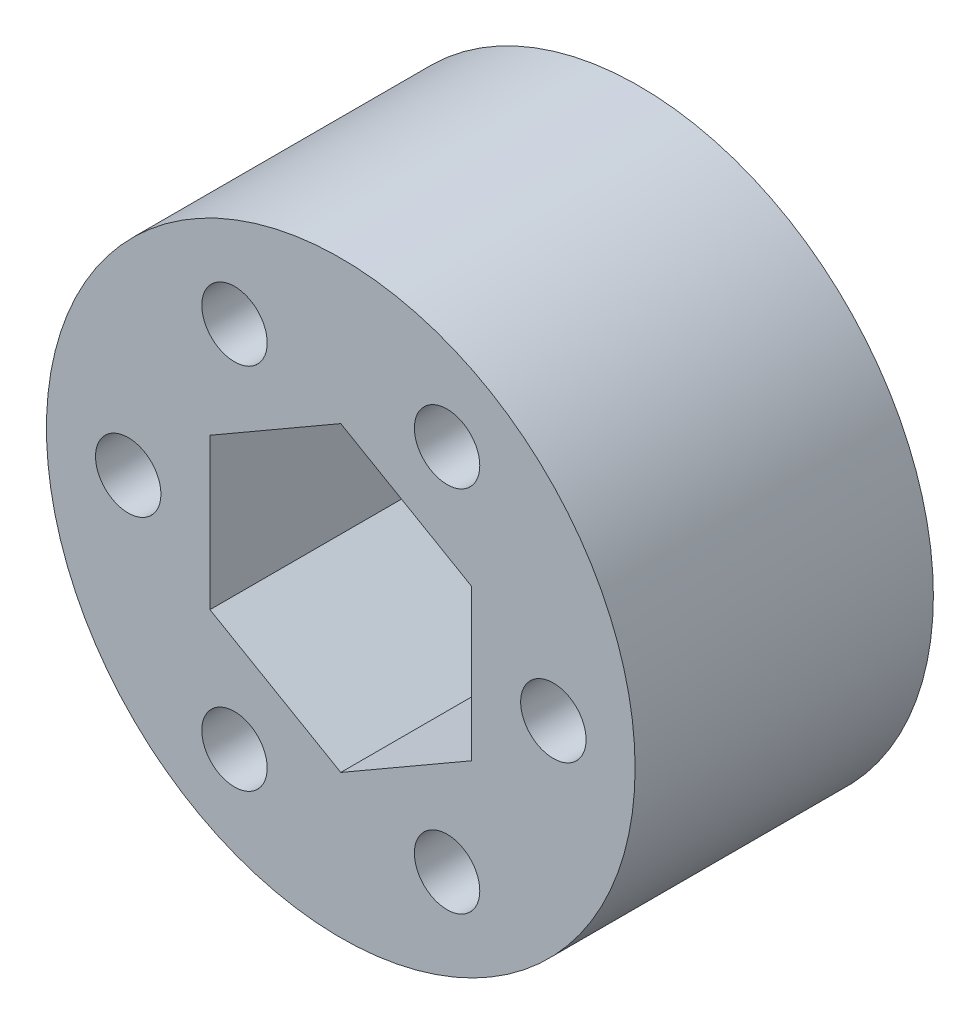
ISO-10303-21;
HEADER;
FILE_DESCRIPTION(('STEP AP214'),'2;1');
FILE_NAME('part.step','',(''),(''),'','','');
FILE_SCHEMA(('AUTOMOTIVE_DESIGN { 1 0 10303 214 1 1 1 1 }'));
ENDSEC;
DATA;
#1=APPLICATION_CONTEXT('core data for automotive mechanical design processes');
#2=APPLICATION_PROTOCOL_DEFINITION('international standard','automotive_design',2000,#1);
#3=PRODUCT_CONTEXT('',#1,'mechanical');
#4=PRODUCT('Part','Part','',(#3));
#5=PRODUCT_RELATED_PRODUCT_CATEGORY('part','',(#4));
#6=PRODUCT_DEFINITION_FORMATION('','',#4);
#7=PRODUCT_DEFINITION_CONTEXT('part definition',#1,'design');
#8=PRODUCT_DEFINITION('design','',#6,#7);
#9=PRODUCT_DEFINITION_SHAPE('','',#8);
#10=(LENGTH_UNIT() NAMED_UNIT(*) SI_UNIT(.MILLI.,.METRE.));
#11=(NAMED_UNIT(*) PLANE_ANGLE_UNIT() SI_UNIT($,.RADIAN.));
#12=(NAMED_UNIT(*) SI_UNIT($,.STERADIAN.) SOLID_ANGLE_UNIT());
#13=UNCERTAINTY_MEASURE_WITH_UNIT(LENGTH_MEASURE(1.E-05),#10,'distance_accuracy_value','');
#14=(GEOMETRIC_REPRESENTATION_CONTEXT(3) GLOBAL_UNCERTAINTY_ASSIGNED_CONTEXT((#13)) GLOBAL_UNIT_ASSIGNED_CONTEXT((#10,
#11,#12)) REPRESENTATION_CONTEXT('',''));
#15=CARTESIAN_POINT('',(0.,0.,0.));
#16=DIRECTION('',(0.,0.,1.));
#17=DIRECTION('',(1.,0.,0.));
#18=AXIS2_PLACEMENT_3D('',#15,#16,#17);
#19=CARTESIAN_POINT('',(0.,0.,7.239));
#20=DIRECTION('',(0.,0.,-1.));
#21=DIRECTION('',(-1.,0.,0.));
#22=AXIS2_PLACEMENT_3D('',#19,#20,#21);
#23=CYLINDRICAL_SURFACE('',#22,14.2875);
#24=CARTESIAN_POINT('',(0.,0.,7.239));
#25=DIRECTION('',(0.,0.,1.));
#26=DIRECTION('',(1.,0.,0.));
#27=AXIS2_PLACEMENT_3D('',#24,#25,#26);
#28=CIRCLE('',#27,14.2875);
#29=CARTESIAN_POINT('',(14.2875,0.,7.239));
#30=VERTEX_POINT('',#29);
#31=EDGE_CURVE('E11',#30,#30,#28,.T.);
#32=ORIENTED_EDGE('',*,*,#31,.F.);
#33=EDGE_LOOP('',(#32));
#34=FACE_BOUND('',#33,.T.);
#35=CARTESIAN_POINT('',(0.,0.,-7.239));
#36=DIRECTION('',(0.,0.,1.));
#37=DIRECTION('',(1.,0.,0.));
#38=AXIS2_PLACEMENT_3D('',#35,#36,#37);
#39=CIRCLE('',#38,14.2875);
#40=CARTESIAN_POINT('',(14.2875,0.,-7.239));
#41=VERTEX_POINT('',#40);
#42=EDGE_CURVE('E36',#41,#41,#39,.T.);
#43=ORIENTED_EDGE('',*,*,#42,.T.);
#44=EDGE_LOOP('',(#43));
#45=FACE_BOUND('',#44,.T.);
#46=ADVANCED_FACE('F33',(#34,#45),#23,.T.);
#47=CARTESIAN_POINT('',(0.,0.,7.239));
#48=DIRECTION('',(0.,0.,1.));
#49=DIRECTION('',(1.,0.,0.));
#50=AXIS2_PLACEMENT_3D('',#47,#48,#49);
#51=PLANE('',#50);
#52=CARTESIAN_POINT('',(-5.1593750000001,-8.93629963530062,7.239));
#53=DIRECTION('',(0.,0.,1.));
#54=DIRECTION('',(1.,0.,0.));
#55=AXIS2_PLACEMENT_3D('',#52,#53,#54);
#56=CIRCLE('',#55,1.5875);
#57=CARTESIAN_POINT('',(-3.5718750000001,-8.93629963530062,7.239));
#58=VERTEX_POINT('',#57);
#59=EDGE_CURVE('E110',#58,#58,#56,.T.);
#60=ORIENTED_EDGE('',*,*,#59,.F.);
#61=EDGE_LOOP('',(#60));
#62=FACE_BOUND('',#61,.T.);
#63=CARTESIAN_POINT('',(5.15937499999992,-8.93629963530072,7.239));
#64=DIRECTION('',(0.,0.,1.));
#65=DIRECTION('',(1.,0.,0.));
#66=AXIS2_PLACEMENT_3D('',#63,#64,#65);
#67=CIRCLE('',#66,1.5875);
#68=CARTESIAN_POINT('',(6.74687499999992,-8.93629963530072,7.239));
#69=VERTEX_POINT('',#68);
#70=EDGE_CURVE('E300',#69,#69,#67,.T.);
#71=ORIENTED_EDGE('',*,*,#70,.F.);
#72=EDGE_LOOP('',(#71));
#73=FACE_BOUND('',#72,.T.);
#74=CARTESIAN_POINT('',(10.31875,0.,7.239));
#75=DIRECTION('',(0.,0.,1.));
#76=DIRECTION('',(1.,0.,0.));
#77=AXIS2_PLACEMENT_3D('',#74,#75,#76);
#78=CIRCLE('',#77,1.5875);
#79=CARTESIAN_POINT('',(11.90625,0.,7.239));
#80=VERTEX_POINT('',#79);
#81=EDGE_CURVE('E307',#80,#80,#78,.T.);
#82=ORIENTED_EDGE('',*,*,#81,.F.);
#83=EDGE_LOOP('',(#82));
#84=FACE_BOUND('',#83,.T.);
#85=CARTESIAN_POINT('',(5.15937500000004,8.93629963530065,7.239));
#86=DIRECTION('',(0.,0.,1.));
#87=DIRECTION('',(1.,0.,0.));
#88=AXIS2_PLACEMENT_3D('',#85,#86,#87);
#89=CIRCLE('',#88,1.5875);
#90=CARTESIAN_POINT('',(6.74687500000004,8.93629963530065,7.239));
#91=VERTEX_POINT('',#90);
#92=EDGE_CURVE('E313',#91,#91,#89,.T.);
#93=ORIENTED_EDGE('',*,*,#92,.F.);
#94=EDGE_LOOP('',(#93));
#95=FACE_BOUND('',#94,.T.);
#96=CARTESIAN_POINT('',(-5.15937499999998,8.93629963530069,7.239));
#97=DIRECTION('',(0.,0.,1.));
#98=DIRECTION('',(1.,0.,0.));
#99=AXIS2_PLACEMENT_3D('',#96,#97,#98);
#100=CIRCLE('',#99,1.5875);
#101=CARTESIAN_POINT('',(-3.57187499999998,8.93629963530069,7.239));
#102=VERTEX_POINT('',#101);
#103=EDGE_CURVE('E319',#102,#102,#100,.T.);
#104=ORIENTED_EDGE('',*,*,#103,.F.);
#105=EDGE_LOOP('',(#104));
#106=FACE_BOUND('',#105,.T.);
#107=CARTESIAN_POINT('',(-10.31875,0.,7.239));
#108=DIRECTION('',(0.,0.,1.));
#109=DIRECTION('',(1.,0.,0.));
#110=AXIS2_PLACEMENT_3D('',#107,#108,#109);
#111=CIRCLE('',#110,1.5875);
#112=CARTESIAN_POINT('',(-8.73125,0.,7.239));
#113=VERTEX_POINT('',#112);
#114=EDGE_CURVE('E325',#113,#113,#111,.T.);
#115=ORIENTED_EDGE('',*,*,#114,.F.);
#116=EDGE_LOOP('',(#115));
#117=FACE_BOUND('',#116,.T.);
#118=DIRECTION('',(-0.866025403784439,0.5,0.));
#119=VECTOR('',#118,1.);
#120=CARTESIAN_POINT('',(6.35,3.66617420935412,7.239));
#121=LINE('',#120,#119);
#122=CARTESIAN_POINT('',(6.35,3.66617420935412,7.239));
#123=VERTEX_POINT('',#122);
#124=CARTESIAN_POINT('',(0.,7.33234841870825,7.239));
#125=VERTEX_POINT('',#124);
#126=EDGE_CURVE('E47',#123,#125,#121,.T.);
#127=ORIENTED_EDGE('',*,*,#126,.F.);
#128=DIRECTION('',(0.,1.,0.));
#129=VECTOR('',#128,1.);
#130=CARTESIAN_POINT('',(6.35,-3.66617420935412,7.239));
#131=LINE('',#130,#129);
#132=CARTESIAN_POINT('',(6.35,-3.66617420935412,7.239));
#133=VERTEX_POINT('',#132);
#134=EDGE_CURVE('E104',#133,#123,#131,.T.);
#135=ORIENTED_EDGE('',*,*,#134,.F.);
#136=DIRECTION('',(0.866025403784439,0.5,0.));
#137=VECTOR('',#136,1.);
#138=CARTESIAN_POINT('',(0.,-7.33234841870825,7.239));
#139=LINE('',#138,#137);
#140=CARTESIAN_POINT('',(0.,-7.33234841870825,7.239));
#141=VERTEX_POINT('',#140);
#142=EDGE_CURVE('E107',#141,#133,#139,.T.);
#143=ORIENTED_EDGE('',*,*,#142,.F.);
#144=DIRECTION('',(0.866025403784439,-0.5,0.));
#145=VECTOR('',#144,1.);
#146=CARTESIAN_POINT('',(-6.35,-3.66617420935412,7.239));
#147=LINE('',#146,#145);
#148=CARTESIAN_POINT('',(-6.35,-3.66617420935412,7.239));
#149=VERTEX_POINT('',#148);
#150=EDGE_CURVE('E127',#149,#141,#147,.T.);
#151=ORIENTED_EDGE('',*,*,#150,.F.);
#152=DIRECTION('',(0.,-1.,0.));
#153=VECTOR('',#152,1.);
#154=CARTESIAN_POINT('',(-6.35,3.66617420935412,7.239));
#155=LINE('',#154,#153);
#156=CARTESIAN_POINT('',(-6.35,3.66617420935412,7.239));
#157=VERTEX_POINT('',#156);
#158=EDGE_CURVE('E124',#157,#149,#155,.T.);
#159=ORIENTED_EDGE('',*,*,#158,.F.);
#160=DIRECTION('',(-0.866025403784439,-0.5,0.));
#161=VECTOR('',#160,1.);
#162=CARTESIAN_POINT('',(0.,7.33234841870825,7.239));
#163=LINE('',#162,#161);
#164=EDGE_CURVE('E121',#125,#157,#163,.T.);
#165=ORIENTED_EDGE('',*,*,#164,.F.);
#166=EDGE_LOOP('',(#127,#135,#143,#151,#159,#165));
#167=FACE_BOUND('',#166,.T.);
#168=ORIENTED_EDGE('',*,*,#31,.T.);
#169=EDGE_LOOP('',(#168));
#170=FACE_BOUND('',#169,.T.);
#171=ADVANCED_FACE('F144',(#62,#73,#84,#95,#106,#117,#167,#170),#51,.T.);
#172=CARTESIAN_POINT('',(0.,0.,-7.239));
#173=DIRECTION('',(0.,0.,1.));
#174=DIRECTION('',(1.,0.,0.));
#175=AXIS2_PLACEMENT_3D('',#172,#173,#174);
#176=PLANE('',#175);
#177=CARTESIAN_POINT('',(-5.1593750000001,-8.93629963530062,-7.239));
#178=DIRECTION('',(0.,0.,1.));
#179=DIRECTION('',(1.,0.,0.));
#180=AXIS2_PLACEMENT_3D('',#177,#178,#179);
#181=CIRCLE('',#180,1.5875);
#182=CARTESIAN_POINT('',(-3.5718750000001,-8.93629963530062,-7.239));
#183=VERTEX_POINT('',#182);
#184=EDGE_CURVE('E297',#183,#183,#181,.T.);
#185=ORIENTED_EDGE('',*,*,#184,.T.);
#186=EDGE_LOOP('',(#185));
#187=FACE_BOUND('',#186,.T.);
#188=CARTESIAN_POINT('',(5.15937499999992,-8.93629963530072,-7.239));
#189=DIRECTION('',(0.,0.,1.));
#190=DIRECTION('',(1.,0.,0.));
#191=AXIS2_PLACEMENT_3D('',#188,#189,#190);
#192=CIRCLE('',#191,1.5875);
#193=CARTESIAN_POINT('',(6.74687499999992,-8.93629963530072,-7.239));
#194=VERTEX_POINT('',#193);
#195=EDGE_CURVE('E302',#194,#194,#192,.T.);
#196=ORIENTED_EDGE('',*,*,#195,.T.);
#197=EDGE_LOOP('',(#196));
#198=FACE_BOUND('',#197,.T.);
#199=CARTESIAN_POINT('',(10.31875,0.,-7.239));
#200=DIRECTION('',(0.,0.,1.));
#201=DIRECTION('',(1.,0.,0.));
#202=AXIS2_PLACEMENT_3D('',#199,#200,#201);
#203=CIRCLE('',#202,1.5875);
#204=CARTESIAN_POINT('',(11.90625,0.,-7.239));
#205=VERTEX_POINT('',#204);
#206=EDGE_CURVE('E310',#205,#205,#203,.T.);
#207=ORIENTED_EDGE('',*,*,#206,.T.);
#208=EDGE_LOOP('',(#207));
#209=FACE_BOUND('',#208,.T.);
#210=CARTESIAN_POINT('',(5.15937500000004,8.93629963530065,-7.239));
#211=DIRECTION('',(0.,0.,1.));
#212=DIRECTION('',(1.,0.,0.));
#213=AXIS2_PLACEMENT_3D('',#210,#211,#212);
#214=CIRCLE('',#213,1.5875);
#215=CARTESIAN_POINT('',(6.74687500000004,8.93629963530065,-7.239));
#216=VERTEX_POINT('',#215);
#217=EDGE_CURVE('E316',#216,#216,#214,.T.);
#218=ORIENTED_EDGE('',*,*,#217,.T.);
#219=EDGE_LOOP('',(#218));
#220=FACE_BOUND('',#219,.T.);
#221=CARTESIAN_POINT('',(-5.15937499999998,8.93629963530069,-7.239));
#222=DIRECTION('',(0.,0.,1.));
#223=DIRECTION('',(1.,0.,0.));
#224=AXIS2_PLACEMENT_3D('',#221,#222,#223);
#225=CIRCLE('',#224,1.5875);
#226=CARTESIAN_POINT('',(-3.57187499999998,8.93629963530069,-7.239));
#227=VERTEX_POINT('',#226);
#228=EDGE_CURVE('E322',#227,#227,#225,.T.);
#229=ORIENTED_EDGE('',*,*,#228,.T.);
#230=EDGE_LOOP('',(#229));
#231=FACE_BOUND('',#230,.T.);
#232=CARTESIAN_POINT('',(-10.31875,0.,-7.239));
#233=DIRECTION('',(0.,0.,1.));
#234=DIRECTION('',(1.,0.,0.));
#235=AXIS2_PLACEMENT_3D('',#232,#233,#234);
#236=CIRCLE('',#235,1.5875);
#237=CARTESIAN_POINT('',(-8.73125,0.,-7.239));
#238=VERTEX_POINT('',#237);
#239=EDGE_CURVE('E122',#238,#238,#236,.T.);
#240=ORIENTED_EDGE('',*,*,#239,.T.);
#241=EDGE_LOOP('',(#240));
#242=FACE_BOUND('',#241,.T.);
#243=DIRECTION('',(0.,1.,0.));
#244=VECTOR('',#243,1.);
#245=CARTESIAN_POINT('',(6.35,-3.66617420935412,-7.239));
#246=LINE('',#245,#244);
#247=CARTESIAN_POINT('',(6.35,-3.66617420935412,-7.239));
#248=VERTEX_POINT('',#247);
#249=CARTESIAN_POINT('',(6.35,3.66617420935412,-7.239));
#250=VERTEX_POINT('',#249);
#251=EDGE_CURVE('E93',#248,#250,#246,.T.);
#252=ORIENTED_EDGE('',*,*,#251,.T.);
#253=DIRECTION('',(-0.866025403784439,0.5,0.));
#254=VECTOR('',#253,1.);
#255=CARTESIAN_POINT('',(6.35,3.66617420935412,-7.239));
#256=LINE('',#255,#254);
#257=CARTESIAN_POINT('',(0.,7.33234841870825,-7.239));
#258=VERTEX_POINT('',#257);
#259=EDGE_CURVE('E87',#250,#258,#256,.T.);
#260=ORIENTED_EDGE('',*,*,#259,.T.);
#261=DIRECTION('',(-0.866025403784439,-0.5,0.));
#262=VECTOR('',#261,1.);
#263=CARTESIAN_POINT('',(0.,7.33234841870825,-7.239));
#264=LINE('',#263,#262);
#265=CARTESIAN_POINT('',(-6.35,3.66617420935412,-7.239));
#266=VERTEX_POINT('',#265);
#267=EDGE_CURVE('E96',#258,#266,#264,.T.);
#268=ORIENTED_EDGE('',*,*,#267,.T.);
#269=DIRECTION('',(0.,-1.,0.));
#270=VECTOR('',#269,1.);
#271=CARTESIAN_POINT('',(-6.35,3.66617420935412,-7.239));
#272=LINE('',#271,#270);
#273=CARTESIAN_POINT('',(-6.35,-3.66617420935412,-7.239));
#274=VERTEX_POINT('',#273);
#275=EDGE_CURVE('E55',#266,#274,#272,.T.);
#276=ORIENTED_EDGE('',*,*,#275,.T.);
#277=DIRECTION('',(0.866025403784439,-0.5,0.));
#278=VECTOR('',#277,1.);
#279=CARTESIAN_POINT('',(-6.35,-3.66617420935412,-7.239));
#280=LINE('',#279,#278);
#281=CARTESIAN_POINT('',(0.,-7.33234841870825,-7.239));
#282=VERTEX_POINT('',#281);
#283=EDGE_CURVE('E114',#274,#282,#280,.T.);
#284=ORIENTED_EDGE('',*,*,#283,.T.);
#285=DIRECTION('',(0.866025403784439,0.5,0.));
#286=VECTOR('',#285,1.);
#287=CARTESIAN_POINT('',(0.,-7.33234841870825,-7.239));
#288=LINE('',#287,#286);
#289=EDGE_CURVE('E117',#282,#248,#288,.T.);
#290=ORIENTED_EDGE('',*,*,#289,.T.);
#291=EDGE_LOOP('',(#252,#260,#268,#276,#284,#290));
#292=FACE_BOUND('',#291,.T.);
#293=ORIENTED_EDGE('',*,*,#42,.F.);
#294=EDGE_LOOP('',(#293));
#295=FACE_BOUND('',#294,.T.);
#296=ADVANCED_FACE('F100',(#187,#198,#209,#220,#231,#242,#292,#295),#176,.F.);
#297=CARTESIAN_POINT('',(6.35,3.66617420935412,-7.239));
#298=DIRECTION('',(0.5,0.866025403784439,0.));
#299=DIRECTION('',(-0.866025403784439,0.5,0.));
#300=AXIS2_PLACEMENT_3D('',#297,#298,#299);
#301=PLANE('',#300);
#302=ORIENTED_EDGE('',*,*,#126,.T.);
#303=DIRECTION('',(0.,0.,1.));
#304=VECTOR('',#303,1.);
#305=CARTESIAN_POINT('',(0.,7.33234841870825,-7.239));
#306=LINE('',#305,#304);
#307=EDGE_CURVE('E83',#258,#125,#306,.T.);
#308=ORIENTED_EDGE('',*,*,#307,.F.);
#309=ORIENTED_EDGE('',*,*,#259,.F.);
#310=DIRECTION('',(0.,0.,1.));
#311=VECTOR('',#310,1.);
#312=CARTESIAN_POINT('',(6.35,3.66617420935412,-7.239));
#313=LINE('',#312,#311);
#314=EDGE_CURVE('E132',#250,#123,#313,.T.);
#315=ORIENTED_EDGE('',*,*,#314,.T.);
#316=EDGE_LOOP('',(#302,#308,#309,#315));
#317=FACE_BOUND('',#316,.T.);
#318=ADVANCED_FACE('F85',(#317),#301,.F.);
#319=CARTESIAN_POINT('',(6.35,-3.66617420935412,-7.239));
#320=DIRECTION('',(1.,0.,0.));
#321=DIRECTION('',(0.,0.,-1.));
#322=AXIS2_PLACEMENT_3D('',#319,#320,#321);
#323=PLANE('',#322);
#324=ORIENTED_EDGE('',*,*,#134,.T.);
#325=ORIENTED_EDGE('',*,*,#314,.F.);
#326=ORIENTED_EDGE('',*,*,#251,.F.);
#327=DIRECTION('',(0.,0.,1.));
#328=VECTOR('',#327,1.);
#329=CARTESIAN_POINT('',(6.35,-3.66617420935412,-7.239));
#330=LINE('',#329,#328);
#331=EDGE_CURVE('E134',#248,#133,#330,.T.);
#332=ORIENTED_EDGE('',*,*,#331,.T.);
#333=EDGE_LOOP('',(#324,#325,#326,#332));
#334=FACE_BOUND('',#333,.T.);
#335=ADVANCED_FACE('F155',(#334),#323,.F.);
#336=CARTESIAN_POINT('',(0.,-7.33234841870825,-7.239));
#337=DIRECTION('',(0.5,-0.866025403784439,0.));
#338=DIRECTION('',(0.866025403784439,0.5,0.));
#339=AXIS2_PLACEMENT_3D('',#336,#337,#338);
#340=PLANE('',#339);
#341=ORIENTED_EDGE('',*,*,#142,.T.);
#342=ORIENTED_EDGE('',*,*,#331,.F.);
#343=ORIENTED_EDGE('',*,*,#289,.F.);
#344=DIRECTION('',(0.,0.,1.));
#345=VECTOR('',#344,1.);
#346=CARTESIAN_POINT('',(0.,-7.33234841870825,-7.239));
#347=LINE('',#346,#345);
#348=EDGE_CURVE('E136',#282,#141,#347,.T.);
#349=ORIENTED_EDGE('',*,*,#348,.T.);
#350=EDGE_LOOP('',(#341,#342,#343,#349));
#351=FACE_BOUND('',#350,.T.);
#352=ADVANCED_FACE('F153',(#351),#340,.F.);
#353=CARTESIAN_POINT('',(-6.35,-3.66617420935412,-7.239));
#354=DIRECTION('',(-0.5,-0.866025403784439,0.));
#355=DIRECTION('',(0.866025403784439,-0.5,0.));
#356=AXIS2_PLACEMENT_3D('',#353,#354,#355);
#357=PLANE('',#356);
#358=ORIENTED_EDGE('',*,*,#150,.T.);
#359=ORIENTED_EDGE('',*,*,#348,.F.);
#360=ORIENTED_EDGE('',*,*,#283,.F.);
#361=DIRECTION('',(0.,0.,1.));
#362=VECTOR('',#361,1.);
#363=CARTESIAN_POINT('',(-6.35,-3.66617420935412,-7.239));
#364=LINE('',#363,#362);
#365=EDGE_CURVE('E138',#274,#149,#364,.T.);
#366=ORIENTED_EDGE('',*,*,#365,.T.);
#367=EDGE_LOOP('',(#358,#359,#360,#366));
#368=FACE_BOUND('',#367,.T.);
#369=ADVANCED_FACE('F149',(#368),#357,.F.);
#370=CARTESIAN_POINT('',(-6.35,3.66617420935412,-7.239));
#371=DIRECTION('',(-1.,0.,0.));
#372=DIRECTION('',(0.,0.,1.));
#373=AXIS2_PLACEMENT_3D('',#370,#371,#372);
#374=PLANE('',#373);
#375=ORIENTED_EDGE('',*,*,#158,.T.);
#376=ORIENTED_EDGE('',*,*,#365,.F.);
#377=ORIENTED_EDGE('',*,*,#275,.F.);
#378=DIRECTION('',(0.,0.,1.));
#379=VECTOR('',#378,1.);
#380=CARTESIAN_POINT('',(-6.35,3.66617420935412,-7.239));
#381=LINE('',#380,#379);
#382=EDGE_CURVE('E92',#266,#157,#381,.T.);
#383=ORIENTED_EDGE('',*,*,#382,.T.);
#384=EDGE_LOOP('',(#375,#376,#377,#383));
#385=FACE_BOUND('',#384,.T.);
#386=ADVANCED_FACE('F140',(#385),#374,.F.);
#387=CARTESIAN_POINT('',(0.,7.33234841870825,-7.239));
#388=DIRECTION('',(-0.5,0.866025403784439,0.));
#389=DIRECTION('',(-0.866025403784439,-0.5,0.));
#390=AXIS2_PLACEMENT_3D('',#387,#388,#389);
#391=PLANE('',#390);
#392=ORIENTED_EDGE('',*,*,#164,.T.);
#393=ORIENTED_EDGE('',*,*,#382,.F.);
#394=ORIENTED_EDGE('',*,*,#267,.F.);
#395=ORIENTED_EDGE('',*,*,#307,.T.);
#396=EDGE_LOOP('',(#392,#393,#394,#395));
#397=FACE_BOUND('',#396,.T.);
#398=ADVANCED_FACE('F97',(#397),#391,.F.);
#399=CARTESIAN_POINT('',(-10.31875,0.,-7.239));
#400=DIRECTION('',(0.,0.,1.));
#401=DIRECTION('',(1.,0.,0.));
#402=AXIS2_PLACEMENT_3D('',#399,#400,#401);
#403=CYLINDRICAL_SURFACE('',#402,1.5875);
#404=ORIENTED_EDGE('',*,*,#239,.F.);
#405=EDGE_LOOP('',(#404));
#406=FACE_BOUND('',#405,.T.);
#407=ORIENTED_EDGE('',*,*,#114,.T.);
#408=EDGE_LOOP('',(#407));
#409=FACE_BOUND('',#408,.T.);
#410=ADVANCED_FACE('F185',(#406,#409),#403,.F.);
#411=CARTESIAN_POINT('',(-5.15937499999998,8.93629963530069,-7.239));
#412=DIRECTION('',(0.,0.,1.));
#413=DIRECTION('',(1.,0.,0.));
#414=AXIS2_PLACEMENT_3D('',#411,#412,#413);
#415=CYLINDRICAL_SURFACE('',#414,1.5875);
#416=ORIENTED_EDGE('',*,*,#228,.F.);
#417=EDGE_LOOP('',(#416));
#418=FACE_BOUND('',#417,.T.);
#419=ORIENTED_EDGE('',*,*,#103,.T.);
#420=EDGE_LOOP('',(#419));
#421=FACE_BOUND('',#420,.T.);
#422=ADVANCED_FACE('F207',(#418,#421),#415,.F.);
#423=CARTESIAN_POINT('',(5.15937500000004,8.93629963530065,-7.239));
#424=DIRECTION('',(0.,0.,1.));
#425=DIRECTION('',(1.,0.,0.));
#426=AXIS2_PLACEMENT_3D('',#423,#424,#425);
#427=CYLINDRICAL_SURFACE('',#426,1.5875);
#428=ORIENTED_EDGE('',*,*,#217,.F.);
#429=EDGE_LOOP('',(#428));
#430=FACE_BOUND('',#429,.T.);
#431=ORIENTED_EDGE('',*,*,#92,.T.);
#432=EDGE_LOOP('',(#431));
#433=FACE_BOUND('',#432,.T.);
#434=ADVANCED_FACE('F215',(#430,#433),#427,.F.);
#435=CARTESIAN_POINT('',(10.31875,0.,-7.239));
#436=DIRECTION('',(0.,0.,1.));
#437=DIRECTION('',(1.,0.,0.));
#438=AXIS2_PLACEMENT_3D('',#435,#436,#437);
#439=CYLINDRICAL_SURFACE('',#438,1.5875);
#440=ORIENTED_EDGE('',*,*,#206,.F.);
#441=EDGE_LOOP('',(#440));
#442=FACE_BOUND('',#441,.T.);
#443=ORIENTED_EDGE('',*,*,#81,.T.);
#444=EDGE_LOOP('',(#443));
#445=FACE_BOUND('',#444,.T.);
#446=ADVANCED_FACE('F223',(#442,#445),#439,.F.);
#447=CARTESIAN_POINT('',(5.15937499999992,-8.93629963530072,-7.239));
#448=DIRECTION('',(0.,0.,1.));
#449=DIRECTION('',(1.,0.,0.));
#450=AXIS2_PLACEMENT_3D('',#447,#448,#449);
#451=CYLINDRICAL_SURFACE('',#450,1.5875);
#452=ORIENTED_EDGE('',*,*,#195,.F.);
#453=EDGE_LOOP('',(#452));
#454=FACE_BOUND('',#453,.T.);
#455=ORIENTED_EDGE('',*,*,#70,.T.);
#456=EDGE_LOOP('',(#455));
#457=FACE_BOUND('',#456,.T.);
#458=ADVANCED_FACE('F231',(#454,#457),#451,.F.);
#459=CARTESIAN_POINT('',(-5.1593750000001,-8.93629963530062,-7.239));
#460=DIRECTION('',(0.,0.,1.));
#461=DIRECTION('',(1.,0.,0.));
#462=AXIS2_PLACEMENT_3D('',#459,#460,#461);
#463=CYLINDRICAL_SURFACE('',#462,1.5875);
#464=ORIENTED_EDGE('',*,*,#184,.F.);
#465=EDGE_LOOP('',(#464));
#466=FACE_BOUND('',#465,.T.);
#467=ORIENTED_EDGE('',*,*,#59,.T.);
#468=EDGE_LOOP('',(#467));
#469=FACE_BOUND('',#468,.T.);
#470=ADVANCED_FACE('F239',(#466,#469),#463,.F.);
#471=CLOSED_SHELL('',(#46,#171,#296,#318,#335,#352,#369,#386,#398,#410,#422,#434,#446,#458,#470));
#472=MANIFOLD_SOLID_BREP('B2',#471);
#473=ADVANCED_BREP_SHAPE_REPRESENTATION('',(#18,#472),#14);
#474=SHAPE_DEFINITION_REPRESENTATION(#9,#473);
ENDSEC;
END-ISO-10303-21;
